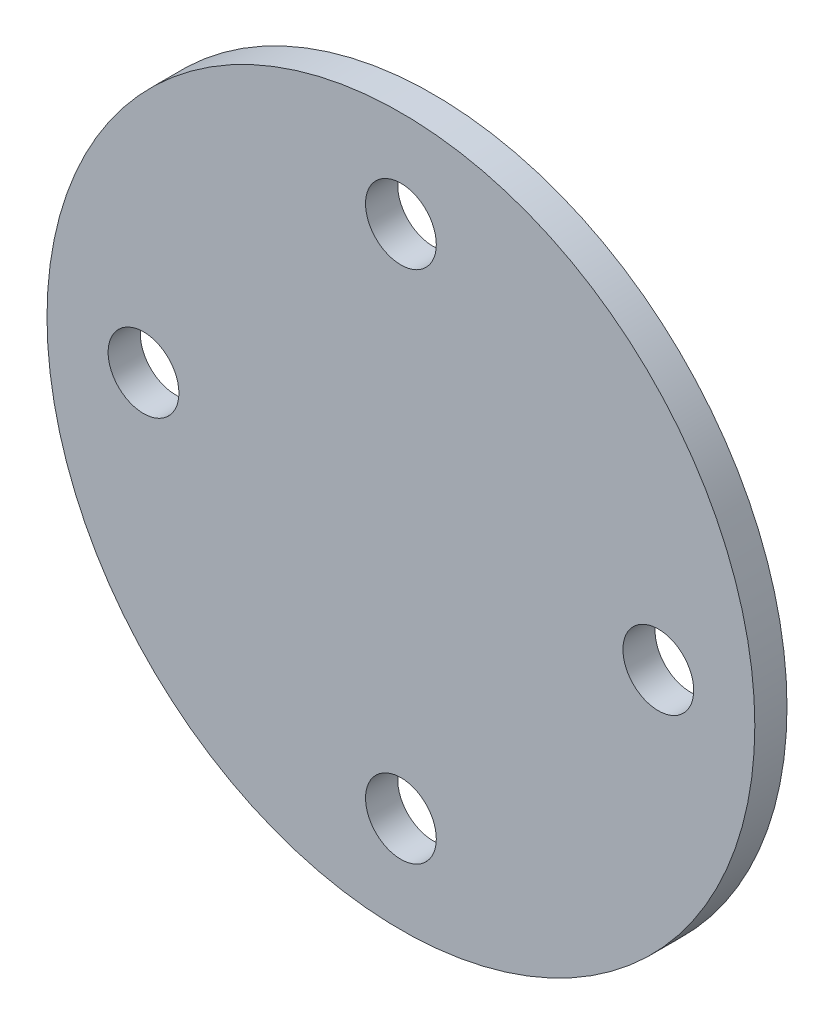
ISO-10303-21;
HEADER;
FILE_DESCRIPTION(('STEP AP214'),'2;1');
FILE_NAME('part.step','',(''),(''),'','','');
FILE_SCHEMA(('AUTOMOTIVE_DESIGN { 1 0 10303 214 1 1 1 1 }'));
ENDSEC;
DATA;
#1=APPLICATION_CONTEXT('core data for automotive mechanical design processes');
#2=APPLICATION_PROTOCOL_DEFINITION('international standard','automotive_design',2000,#1);
#3=PRODUCT_CONTEXT('',#1,'mechanical');
#4=PRODUCT('Part','Part','',(#3));
#5=PRODUCT_RELATED_PRODUCT_CATEGORY('part','',(#4));
#6=PRODUCT_DEFINITION_FORMATION('','',#4);
#7=PRODUCT_DEFINITION_CONTEXT('part definition',#1,'design');
#8=PRODUCT_DEFINITION('design','',#6,#7);
#9=PRODUCT_DEFINITION_SHAPE('','',#8);
#10=(LENGTH_UNIT() NAMED_UNIT(*) SI_UNIT(.MILLI.,.METRE.));
#11=(NAMED_UNIT(*) PLANE_ANGLE_UNIT() SI_UNIT($,.RADIAN.));
#12=(NAMED_UNIT(*) SI_UNIT($,.STERADIAN.) SOLID_ANGLE_UNIT());
#13=UNCERTAINTY_MEASURE_WITH_UNIT(LENGTH_MEASURE(1.E-05),#10,'distance_accuracy_value','');
#14=(GEOMETRIC_REPRESENTATION_CONTEXT(3) GLOBAL_UNCERTAINTY_ASSIGNED_CONTEXT((#13)) GLOBAL_UNIT_ASSIGNED_CONTEXT((#10,
#11,#12)) REPRESENTATION_CONTEXT('',''));
#15=CARTESIAN_POINT('',(0.,0.,0.));
#16=DIRECTION('',(0.,0.,1.));
#17=DIRECTION('',(1.,0.,0.));
#18=AXIS2_PLACEMENT_3D('',#15,#16,#17);
#19=CARTESIAN_POINT('',(0.,0.,1.));
#20=DIRECTION('',(0.,0.,1.));
#21=DIRECTION('',(1.,0.,0.));
#22=AXIS2_PLACEMENT_3D('',#19,#20,#21);
#23=PLANE('',#22);
#24=CARTESIAN_POINT('',(2.00635410462953E-13,-8.,1.));
#25=DIRECTION('',(0.,0.,1.));
#26=DIRECTION('',(1.,0.,0.));
#27=AXIS2_PLACEMENT_3D('',#24,#25,#26);
#28=CIRCLE('',#27,1.1);
#29=CARTESIAN_POINT('',(1.1000000000002,-8.,1.));
#30=VERTEX_POINT('',#29);
#31=EDGE_CURVE('E64',#30,#30,#28,.T.);
#32=ORIENTED_EDGE('',*,*,#31,.F.);
#33=EDGE_LOOP('',(#32));
#34=FACE_BOUND('',#33,.T.);
#35=CARTESIAN_POINT('',(0.,8.,1.));
#36=DIRECTION('',(0.,0.,1.));
#37=DIRECTION('',(1.,0.,0.));
#38=AXIS2_PLACEMENT_3D('',#35,#36,#37);
#39=CIRCLE('',#38,1.1);
#40=CARTESIAN_POINT('',(1.1,8.,1.));
#41=VERTEX_POINT('',#40);
#42=EDGE_CURVE('E50',#41,#41,#39,.T.);
#43=ORIENTED_EDGE('',*,*,#42,.F.);
#44=EDGE_LOOP('',(#43));
#45=FACE_BOUND('',#44,.T.);
#46=CARTESIAN_POINT('',(0.,0.,1.));
#47=DIRECTION('',(0.,0.,1.));
#48=DIRECTION('',(1.,0.,0.));
#49=AXIS2_PLACEMENT_3D('',#46,#47,#48);
#50=CIRCLE('',#49,11.);
#51=CARTESIAN_POINT('',(11.,0.,1.));
#52=VERTEX_POINT('',#51);
#53=EDGE_CURVE('E10',#52,#52,#50,.T.);
#54=ORIENTED_EDGE('',*,*,#53,.T.);
#55=EDGE_LOOP('',(#54));
#56=FACE_BOUND('',#55,.T.);
#57=CARTESIAN_POINT('',(8.0000000000001,1.00317705231477E-13,1.));
#58=DIRECTION('',(0.,0.,1.));
#59=DIRECTION('',(1.,0.,0.));
#60=AXIS2_PLACEMENT_3D('',#57,#58,#59);
#61=CIRCLE('',#60,1.1);
#62=CARTESIAN_POINT('',(9.1000000000001,1.00317705231477E-13,1.));
#63=VERTEX_POINT('',#62);
#64=EDGE_CURVE('E56',#63,#63,#61,.T.);
#65=ORIENTED_EDGE('',*,*,#64,.F.);
#66=EDGE_LOOP('',(#65));
#67=FACE_BOUND('',#66,.T.);
#68=CARTESIAN_POINT('',(-7.9999999999999,-1.01297422670795E-13,1.));
#69=DIRECTION('',(0.,0.,1.));
#70=DIRECTION('',(1.,0.,0.));
#71=AXIS2_PLACEMENT_3D('',#68,#69,#70);
#72=CIRCLE('',#71,1.1);
#73=CARTESIAN_POINT('',(-6.8999999999999,-1.01297422670795E-13,1.));
#74=VERTEX_POINT('',#73);
#75=EDGE_CURVE('E72',#74,#74,#72,.T.);
#76=ORIENTED_EDGE('',*,*,#75,.F.);
#77=EDGE_LOOP('',(#76));
#78=FACE_BOUND('',#77,.T.);
#79=ADVANCED_FACE('F37',(#34,#45,#56,#67,#78),#23,.T.);
#80=CARTESIAN_POINT('',(0.,0.,0.));
#81=DIRECTION('',(0.,0.,1.));
#82=DIRECTION('',(1.,0.,0.));
#83=AXIS2_PLACEMENT_3D('',#80,#81,#82);
#84=PLANE('',#83);
#85=CARTESIAN_POINT('',(0.,0.,0.));
#86=DIRECTION('',(0.,0.,1.));
#87=DIRECTION('',(1.,0.,0.));
#88=AXIS2_PLACEMENT_3D('',#85,#86,#87);
#89=CIRCLE('',#88,11.);
#90=CARTESIAN_POINT('',(11.,0.,0.));
#91=VERTEX_POINT('',#90);
#92=EDGE_CURVE('E41',#91,#91,#89,.T.);
#93=ORIENTED_EDGE('',*,*,#92,.F.);
#94=EDGE_LOOP('',(#93));
#95=FACE_BOUND('',#94,.T.);
#96=CARTESIAN_POINT('',(0.,8.,0.));
#97=DIRECTION('',(0.,0.,1.));
#98=DIRECTION('',(1.,0.,0.));
#99=AXIS2_PLACEMENT_3D('',#96,#97,#98);
#100=CIRCLE('',#99,1.1);
#101=CARTESIAN_POINT('',(1.1,8.,0.));
#102=VERTEX_POINT('',#101);
#103=EDGE_CURVE('E52',#102,#102,#100,.T.);
#104=ORIENTED_EDGE('',*,*,#103,.T.);
#105=EDGE_LOOP('',(#104));
#106=FACE_BOUND('',#105,.T.);
#107=CARTESIAN_POINT('',(8.0000000000001,1.00317705231477E-13,0.));
#108=DIRECTION('',(0.,0.,1.));
#109=DIRECTION('',(1.,0.,0.));
#110=AXIS2_PLACEMENT_3D('',#107,#108,#109);
#111=CIRCLE('',#110,1.1);
#112=CARTESIAN_POINT('',(9.1000000000001,1.00317705231477E-13,0.));
#113=VERTEX_POINT('',#112);
#114=EDGE_CURVE('E60',#113,#113,#111,.T.);
#115=ORIENTED_EDGE('',*,*,#114,.T.);
#116=EDGE_LOOP('',(#115));
#117=FACE_BOUND('',#116,.T.);
#118=CARTESIAN_POINT('',(2.00635410462953E-13,-8.,0.));
#119=DIRECTION('',(0.,0.,1.));
#120=DIRECTION('',(1.,0.,0.));
#121=AXIS2_PLACEMENT_3D('',#118,#119,#120);
#122=CIRCLE('',#121,1.1);
#123=CARTESIAN_POINT('',(1.1000000000002,-8.,0.));
#124=VERTEX_POINT('',#123);
#125=EDGE_CURVE('E68',#124,#124,#122,.T.);
#126=ORIENTED_EDGE('',*,*,#125,.T.);
#127=EDGE_LOOP('',(#126));
#128=FACE_BOUND('',#127,.T.);
#129=CARTESIAN_POINT('',(-7.9999999999999,-1.01297422670795E-13,0.));
#130=DIRECTION('',(0.,0.,1.));
#131=DIRECTION('',(1.,0.,0.));
#132=AXIS2_PLACEMENT_3D('',#129,#130,#131);
#133=CIRCLE('',#132,1.1);
#134=CARTESIAN_POINT('',(-6.8999999999999,-1.01297422670795E-13,0.));
#135=VERTEX_POINT('',#134);
#136=EDGE_CURVE('E76',#135,#135,#133,.T.);
#137=ORIENTED_EDGE('',*,*,#136,.T.);
#138=EDGE_LOOP('',(#137));
#139=FACE_BOUND('',#138,.T.);
#140=ADVANCED_FACE('F88',(#95,#106,#117,#128,#139),#84,.F.);
#141=CARTESIAN_POINT('',(0.,0.,1.));
#142=DIRECTION('',(0.,0.,-1.));
#143=DIRECTION('',(-1.,0.,0.));
#144=AXIS2_PLACEMENT_3D('',#141,#142,#143);
#145=CYLINDRICAL_SURFACE('',#144,11.);
#146=ORIENTED_EDGE('',*,*,#53,.F.);
#147=EDGE_LOOP('',(#146));
#148=FACE_BOUND('',#147,.T.);
#149=ORIENTED_EDGE('',*,*,#92,.T.);
#150=EDGE_LOOP('',(#149));
#151=FACE_BOUND('',#150,.T.);
#152=ADVANCED_FACE('F39',(#148,#151),#145,.T.);
#153=CARTESIAN_POINT('',(0.,8.,1.));
#154=DIRECTION('',(0.,0.,-1.));
#155=DIRECTION('',(-1.,0.,0.));
#156=AXIS2_PLACEMENT_3D('',#153,#154,#155);
#157=CYLINDRICAL_SURFACE('',#156,1.1);
#158=ORIENTED_EDGE('',*,*,#42,.T.);
#159=EDGE_LOOP('',(#158));
#160=FACE_BOUND('',#159,.T.);
#161=ORIENTED_EDGE('',*,*,#103,.F.);
#162=EDGE_LOOP('',(#161));
#163=FACE_BOUND('',#162,.T.);
#164=ADVANCED_FACE('F98',(#160,#163),#157,.F.);
#165=CARTESIAN_POINT('',(8.0000000000001,1.00317705231477E-13,1.));
#166=DIRECTION('',(0.,0.,-1.));
#167=DIRECTION('',(-1.,0.,0.));
#168=AXIS2_PLACEMENT_3D('',#165,#166,#167);
#169=CYLINDRICAL_SURFACE('',#168,1.1);
#170=ORIENTED_EDGE('',*,*,#64,.T.);
#171=EDGE_LOOP('',(#170));
#172=FACE_BOUND('',#171,.T.);
#173=ORIENTED_EDGE('',*,*,#114,.F.);
#174=EDGE_LOOP('',(#173));
#175=FACE_BOUND('',#174,.T.);
#176=ADVANCED_FACE('F101',(#172,#175),#169,.F.);
#177=CARTESIAN_POINT('',(2.00635410462953E-13,-8.,1.));
#178=DIRECTION('',(0.,0.,-1.));
#179=DIRECTION('',(-1.,0.,0.));
#180=AXIS2_PLACEMENT_3D('',#177,#178,#179);
#181=CYLINDRICAL_SURFACE('',#180,1.1);
#182=ORIENTED_EDGE('',*,*,#31,.T.);
#183=EDGE_LOOP('',(#182));
#184=FACE_BOUND('',#183,.T.);
#185=ORIENTED_EDGE('',*,*,#125,.F.);
#186=EDGE_LOOP('',(#185));
#187=FACE_BOUND('',#186,.T.);
#188=ADVANCED_FACE('F105',(#184,#187),#181,.F.);
#189=CARTESIAN_POINT('',(-7.9999999999999,-1.01297422670795E-13,1.));
#190=DIRECTION('',(0.,0.,-1.));
#191=DIRECTION('',(-1.,0.,0.));
#192=AXIS2_PLACEMENT_3D('',#189,#190,#191);
#193=CYLINDRICAL_SURFACE('',#192,1.1);
#194=ORIENTED_EDGE('',*,*,#75,.T.);
#195=EDGE_LOOP('',(#194));
#196=FACE_BOUND('',#195,.T.);
#197=ORIENTED_EDGE('',*,*,#136,.F.);
#198=EDGE_LOOP('',(#197));
#199=FACE_BOUND('',#198,.T.);
#200=ADVANCED_FACE('F84',(#196,#199),#193,.F.);
#201=CLOSED_SHELL('',(#79,#140,#152,#164,#176,#188,#200));
#202=MANIFOLD_SOLID_BREP('B2',#201);
#203=ADVANCED_BREP_SHAPE_REPRESENTATION('',(#18,#202),#14);
#204=SHAPE_DEFINITION_REPRESENTATION(#9,#203);
ENDSEC;
END-ISO-10303-21;
